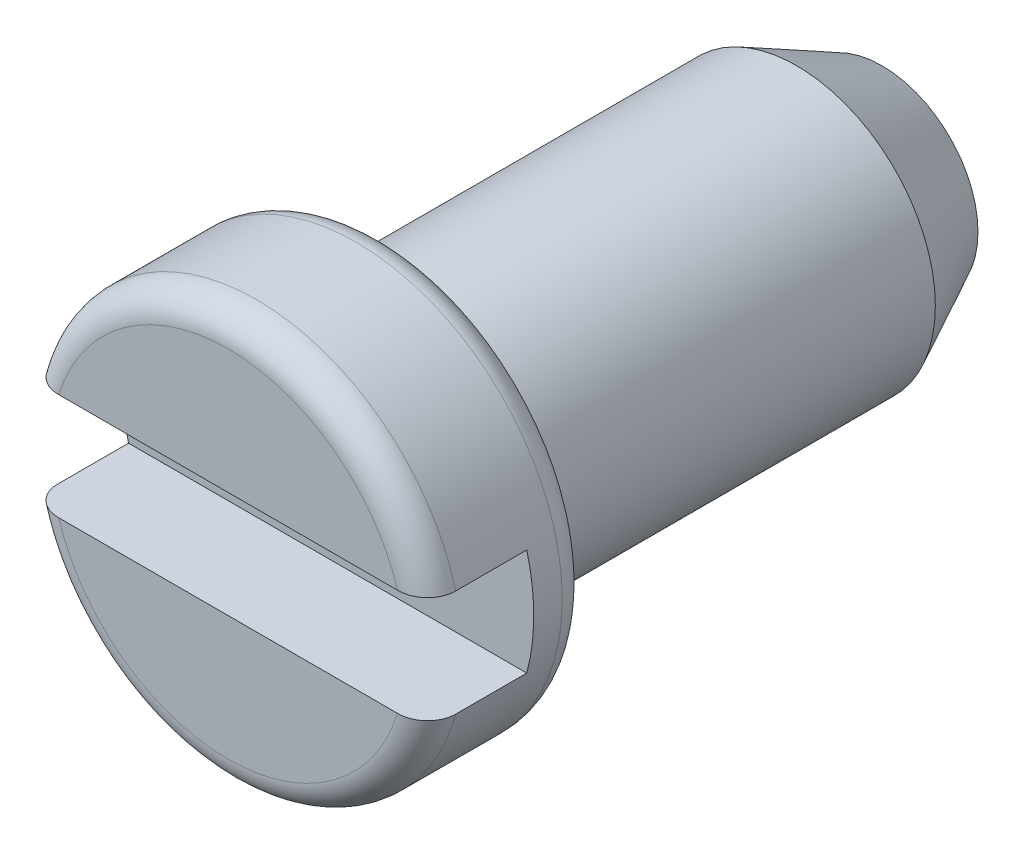
ISO-10303-21;
HEADER;
FILE_DESCRIPTION(('STEP AP214'),'2;1');
FILE_NAME('part.step','',(''),(''),'','','');
FILE_SCHEMA(('AUTOMOTIVE_DESIGN { 1 0 10303 214 1 1 1 1 }'));
ENDSEC;
DATA;
#1=APPLICATION_CONTEXT('core data for automotive mechanical design processes');
#2=APPLICATION_PROTOCOL_DEFINITION('international standard','automotive_design',2000,#1);
#3=PRODUCT_CONTEXT('',#1,'mechanical');
#4=PRODUCT('Part','Part','',(#3));
#5=PRODUCT_RELATED_PRODUCT_CATEGORY('part','',(#4));
#6=PRODUCT_DEFINITION_FORMATION('','',#4);
#7=PRODUCT_DEFINITION_CONTEXT('part definition',#1,'design');
#8=PRODUCT_DEFINITION('design','',#6,#7);
#9=PRODUCT_DEFINITION_SHAPE('','',#8);
#10=(LENGTH_UNIT() NAMED_UNIT(*) SI_UNIT(.MILLI.,.METRE.));
#11=(NAMED_UNIT(*) PLANE_ANGLE_UNIT() SI_UNIT($,.RADIAN.));
#12=(NAMED_UNIT(*) SI_UNIT($,.STERADIAN.) SOLID_ANGLE_UNIT());
#13=UNCERTAINTY_MEASURE_WITH_UNIT(LENGTH_MEASURE(1.E-05),#10,'distance_accuracy_value','');
#14=(GEOMETRIC_REPRESENTATION_CONTEXT(3) GLOBAL_UNCERTAINTY_ASSIGNED_CONTEXT((#13)) GLOBAL_UNIT_ASSIGNED_CONTEXT((#10,
#11,#12)) REPRESENTATION_CONTEXT('',''));
#15=CARTESIAN_POINT('',(0.,0.,0.));
#16=DIRECTION('',(0.,0.,1.));
#17=DIRECTION('',(1.,0.,0.));
#18=AXIS2_PLACEMENT_3D('',#15,#16,#17);
#19=CARTESIAN_POINT('',(0.,0.,0.35));
#20=DIRECTION('',(0.,0.,-1.));
#21=DIRECTION('',(-1.,0.,0.));
#22=AXIS2_PLACEMENT_3D('',#19,#20,#21);
#23=TOROIDAL_SURFACE('',#22,1.25,0.2);
#24=CARTESIAN_POINT('',(-1.192424001771,0.375,0.55));
#25=CARTESIAN_POINT('',(-1.205905275149,0.375,0.55));
#26=CARTESIAN_POINT('',(-1.219179769755,0.375,0.548770877976));
#27=CARTESIAN_POINT('',(-1.238790043109,0.375,0.545135223558));
#28=CARTESIAN_POINT('',(-1.248519300116,0.375,0.542866356948));
#29=CARTESIAN_POINT('',(-1.258131670012,0.375,0.539902696952));
#30=CARTESIAN_POINT('',(-1.264513248889,0.375,0.537768406951));
#31=CARTESIAN_POINT('',(-1.267686206382,0.375,0.536623074632));
#32=CARTESIAN_POINT('',(-1.283315459234,0.375,0.53056053273));
#33=CARTESIAN_POINT('',(-1.295202592734,0.375,0.524602415318));
#34=CARTESIAN_POINT('',(-1.312110903912,0.375,0.514006734822));
#35=CARTESIAN_POINT('',(-1.317592261197,0.375,0.510196599031));
#36=CARTESIAN_POINT('',(-1.325572501873,0.375,0.504046634682));
#37=CARTESIAN_POINT('',(-1.3281982007,0.375,0.501918522815));
#38=CARTESIAN_POINT('',(-1.333312426626,0.375,0.497560014096));
#39=CARTESIAN_POINT('',(-1.345779523391,0.375,0.486388054892));
#40=CARTESIAN_POINT('',(-1.356699606449,0.375,0.47387689637));
#41=CARTESIAN_POINT('',(-1.366358990695,0.375,0.460274391995));
#42=CARTESIAN_POINT('',(-1.368227266987,0.375,0.457498834191));
#43=CARTESIAN_POINT('',(-1.371833646111,0.375,0.451835031665));
#44=CARTESIAN_POINT('',(-1.373576335314,0.375,0.448938193654));
#45=CARTESIAN_POINT('',(-1.378553308638,0.375,0.440164075521));
#46=CARTESIAN_POINT('',(-1.381547323516,0.375,0.434191477719));
#47=CARTESIAN_POINT('',(-1.389580085944,0.375,0.415912728155));
#48=CARTESIAN_POINT('',(-1.393679256042,0.375,0.403249310381));
#49=CARTESIAN_POINT('',(-1.397164479788,0.375,0.386796922208));
#50=CARTESIAN_POINT('',(-1.397778678454,0.375,0.383472722872));
#51=CARTESIAN_POINT('',(-1.398828487205,0.375,0.376822868939));
#52=CARTESIAN_POINT('',(-1.400140335165,0.375,0.366823180448));
#53=CARTESIAN_POINT('',(-1.400669482783,0.375,0.356749327774));
#54=CARTESIAN_POINT('',(-1.400669482783,0.375,0.35));
#55=B_SPLINE_CURVE_WITH_KNOTS('',3,(#24,#25,#26,#27,#28,#29,#30,#31,#32,#33,#34,#35,#36,#37,#38,
#39,#40,#41,#42,#43,#44,#45,#46,#47,#48,#49,#50,#51,#52,#53,#54),.UNSPECIFIED.,.F.,.F.,(4,2,1,2,
2,2,2,2,1,2,2,2,2,2,2,1,4),(0.,0.125,0.1875,0.21875,0.25,0.375,0.4375,0.46875,0.5,0.625,0.65625,
0.6875,0.75,0.875,0.90625,0.9375,1.),.UNSPECIFIED.);
#56=CARTESIAN_POINT('',(-1.192424001771,0.375,0.55));
#57=VERTEX_POINT('',#56);
#58=CARTESIAN_POINT('',(-1.400669482783,0.375,0.35));
#59=VERTEX_POINT('',#58);
#60=EDGE_CURVE('E28',#57,#59,#55,.T.);
#61=ORIENTED_EDGE('',*,*,#60,.F.);
#62=CARTESIAN_POINT('',(0.,0.,0.55));
#63=DIRECTION('',(0.,0.,-1.));
#64=DIRECTION('',(-1.,0.,0.));
#65=AXIS2_PLACEMENT_3D('',#62,#63,#64);
#66=CIRCLE('',#65,1.25);
#67=CARTESIAN_POINT('',(1.192424001771,0.375,0.55));
#68=VERTEX_POINT('',#67);
#69=EDGE_CURVE('E145',#57,#68,#66,.T.);
#70=ORIENTED_EDGE('',*,*,#69,.T.);
#71=CARTESIAN_POINT('',(1.400669482783,0.375,0.35));
#72=CARTESIAN_POINT('',(1.400669482783,0.375,0.36348821144));
#73=CARTESIAN_POINT('',(1.39927155506,0.375,0.376736777679));
#74=CARTESIAN_POINT('',(1.395170145075,0.375,0.396265994666));
#75=CARTESIAN_POINT('',(1.393466300755,0.375,0.40271801224));
#76=CARTESIAN_POINT('',(1.39039370633,0.375,0.412307439359));
#77=CARTESIAN_POINT('',(1.389279792836,0.375,0.415497299082));
#78=CARTESIAN_POINT('',(1.386901256482,0.375,0.421781597308));
#79=CARTESIAN_POINT('',(1.380569435789,0.375,0.437278736234));
#80=CARTESIAN_POINT('',(1.372381183842,0.375,0.451747167472));
#81=CARTESIAN_POINT('',(1.360794058521,0.375,0.468133335205));
#82=CARTESIAN_POINT('',(1.356612252272,0.375,0.473455476089));
#83=CARTESIAN_POINT('',(1.347817064944,0.375,0.483562464125));
#84=CARTESIAN_POINT('',(1.338571221684,0.375,0.493171067916));
#85=CARTESIAN_POINT('',(1.325922106319,0.375,0.503974379226));
#86=CARTESIAN_POINT('',(1.317842676846,0.375,0.509914514783));
#87=CARTESIAN_POINT('',(1.312346220497,0.375,0.513752767173));
#88=CARTESIAN_POINT('',(1.309535838993,0.375,0.515615433562));
#89=CARTESIAN_POINT('',(1.295296681157,0.375,0.524562472345));
#90=CARTESIAN_POINT('',(1.283384656534,0.375,0.530521562207));
#91=CARTESIAN_POINT('',(1.264776905598,0.375,0.537757526588));
#92=CARTESIAN_POINT('',(1.258450133864,0.375,0.539883659122));
#93=CARTESIAN_POINT('',(1.248771052989,0.375,0.542637995169));
#94=CARTESIAN_POINT('',(1.245505938492,0.375,0.543485034585));
#95=CARTESIAN_POINT('',(1.238960518328,0.375,0.545020529773));
#96=CARTESIAN_POINT('',(1.222547899568,0.375,0.548465328392));
#97=CARTESIAN_POINT('',(1.205897358943,0.375,0.55));
#98=CARTESIAN_POINT('',(1.192424001771,0.375,0.55));
#99=B_SPLINE_CURVE_WITH_KNOTS('',3,(#71,#72,#73,#74,#75,#76,#77,#78,#79,#80,#81,#82,#83,#84,#85,
#86,#87,#88,#89,#90,#91,#92,#93,#94,#95,#96,#97,#98),.UNSPECIFIED.,.F.,.F.,(4,2,2,2,1,2,2,1,1,2,
2,2,2,2,1,4),(0.,0.125,0.1875,0.21875,0.25,0.375,0.4375,0.5,0.5625,0.59375,0.625,0.75,0.8125,
0.84375,0.875,1.),.UNSPECIFIED.);
#100=CARTESIAN_POINT('',(1.400669482783,0.375,0.35));
#101=VERTEX_POINT('',#100);
#102=EDGE_CURVE('E41',#101,#68,#99,.T.);
#103=ORIENTED_EDGE('',*,*,#102,.F.);
#104=CARTESIAN_POINT('',(0.,0.,0.35));
#105=DIRECTION('',(0.,0.,-1.));
#106=DIRECTION('',(-1.,0.,0.));
#107=AXIS2_PLACEMENT_3D('',#104,#105,#106);
#108=CIRCLE('',#107,1.45);
#109=EDGE_CURVE('E127',#59,#101,#108,.T.);
#110=ORIENTED_EDGE('',*,*,#109,.F.);
#111=EDGE_LOOP('',(#61,#70,#103,#110));
#112=FACE_BOUND('',#111,.T.);
#113=ADVANCED_FACE('F17',(#112),#23,.T.);
#114=CARTESIAN_POINT('',(0.,0.,-0.35));
#115=DIRECTION('',(0.,0.,-1.));
#116=DIRECTION('',(-1.,0.,0.));
#117=AXIS2_PLACEMENT_3D('',#114,#115,#116);
#118=TOROIDAL_SURFACE('',#117,1.25,0.2);
#119=CARTESIAN_POINT('',(0.,0.,-0.55));
#120=DIRECTION('',(0.,0.,-1.));
#121=DIRECTION('',(-1.,0.,0.));
#122=AXIS2_PLACEMENT_3D('',#119,#120,#121);
#123=CIRCLE('',#122,1.25);
#124=CARTESIAN_POINT('',(-1.25,0.,-0.55));
#125=VERTEX_POINT('',#124);
#126=EDGE_CURVE('E146',#125,#125,#123,.T.);
#127=ORIENTED_EDGE('',*,*,#126,.F.);
#128=EDGE_LOOP('',(#127));
#129=FACE_BOUND('',#128,.T.);
#130=CARTESIAN_POINT('',(0.,0.,-0.35));
#131=DIRECTION('',(0.,0.,-1.));
#132=DIRECTION('',(-1.,0.,0.));
#133=AXIS2_PLACEMENT_3D('',#130,#131,#132);
#134=CIRCLE('',#133,1.45);
#135=CARTESIAN_POINT('',(-1.45,0.,-0.35));
#136=VERTEX_POINT('',#135);
#137=EDGE_CURVE('E264',#136,#136,#134,.T.);
#138=ORIENTED_EDGE('',*,*,#137,.T.);
#139=EDGE_LOOP('',(#138));
#140=FACE_BOUND('',#139,.T.);
#141=ADVANCED_FACE('F199',(#129,#140),#118,.T.);
#142=CARTESIAN_POINT('',(0.,0.,0.35));
#143=DIRECTION('',(0.,0.,-1.));
#144=DIRECTION('',(-1.,0.,0.));
#145=AXIS2_PLACEMENT_3D('',#142,#143,#144);
#146=TOROIDAL_SURFACE('',#145,1.25,0.2);
#147=CARTESIAN_POINT('',(1.192424001771,-0.375,0.55));
#148=CARTESIAN_POINT('',(1.205905275149,-0.375,0.55));
#149=CARTESIAN_POINT('',(1.219179769755,-0.375,0.548770877976));
#150=CARTESIAN_POINT('',(1.238790043109,-0.375,0.545135223558));
#151=CARTESIAN_POINT('',(1.248519300116,-0.375,0.542866356948));
#152=CARTESIAN_POINT('',(1.258131670012,-0.375,0.539902696952));
#153=CARTESIAN_POINT('',(1.264513248889,-0.375,0.537768406951));
#154=CARTESIAN_POINT('',(1.267686206382,-0.375,0.536623074632));
#155=CARTESIAN_POINT('',(1.283315459234,-0.375,0.53056053273));
#156=CARTESIAN_POINT('',(1.295202592734,-0.375,0.524602415318));
#157=CARTESIAN_POINT('',(1.312110903912,-0.375,0.514006734822));
#158=CARTESIAN_POINT('',(1.317592261197,-0.375,0.510196599031));
#159=CARTESIAN_POINT('',(1.325572501873,-0.375,0.504046634682));
#160=CARTESIAN_POINT('',(1.3281982007,-0.375,0.501918522815));
#161=CARTESIAN_POINT('',(1.333312426626,-0.375,0.497560014096));
#162=CARTESIAN_POINT('',(1.345779523391,-0.375,0.486388054892));
#163=CARTESIAN_POINT('',(1.356699606449,-0.375,0.47387689637));
#164=CARTESIAN_POINT('',(1.366358990695,-0.375,0.460274391995));
#165=CARTESIAN_POINT('',(1.368227266987,-0.375,0.457498834191));
#166=CARTESIAN_POINT('',(1.371833646111,-0.375,0.451835031665));
#167=CARTESIAN_POINT('',(1.373576335314,-0.375,0.448938193654));
#168=CARTESIAN_POINT('',(1.378553308638,-0.375,0.440164075521));
#169=CARTESIAN_POINT('',(1.381547323516,-0.375,0.434191477719));
#170=CARTESIAN_POINT('',(1.389580085944,-0.375,0.415912728155));
#171=CARTESIAN_POINT('',(1.393679256042,-0.375,0.403249310381));
#172=CARTESIAN_POINT('',(1.397164479788,-0.375,0.386796922208));
#173=CARTESIAN_POINT('',(1.397778678454,-0.375,0.383472722872));
#174=CARTESIAN_POINT('',(1.398828487205,-0.375,0.376822868939));
#175=CARTESIAN_POINT('',(1.400140335165,-0.375,0.366823180448));
#176=CARTESIAN_POINT('',(1.400669482783,-0.375,0.356749327774));
#177=CARTESIAN_POINT('',(1.400669482783,-0.375,0.35));
#178=B_SPLINE_CURVE_WITH_KNOTS('',3,(#147,#148,#149,#150,#151,#152,#153,#154,#155,#156,#157,
#158,#159,#160,#161,#162,#163,#164,#165,#166,#167,#168,#169,#170,#171,#172,#173,#174,#175,#176,
#177),.UNSPECIFIED.,.F.,.F.,(4,2,1,2,2,2,2,2,1,2,2,2,2,2,2,1,4),(0.,0.125,0.1875,0.21875,0.25,
0.375,0.4375,0.46875,0.5,0.625,0.65625,0.6875,0.75,0.875,0.90625,0.9375,1.),.UNSPECIFIED.);
#179=CARTESIAN_POINT('',(1.192424001771,-0.375,0.55));
#180=VERTEX_POINT('',#179);
#181=CARTESIAN_POINT('',(1.400669482783,-0.375,0.35));
#182=VERTEX_POINT('',#181);
#183=EDGE_CURVE('E96',#180,#182,#178,.T.);
#184=ORIENTED_EDGE('',*,*,#183,.F.);
#185=CARTESIAN_POINT('',(0.,0.,0.55));
#186=DIRECTION('',(0.,0.,-1.));
#187=DIRECTION('',(-1.,0.,0.));
#188=AXIS2_PLACEMENT_3D('',#185,#186,#187);
#189=CIRCLE('',#188,1.25);
#190=CARTESIAN_POINT('',(-1.192424001771,-0.375,0.55));
#191=VERTEX_POINT('',#190);
#192=EDGE_CURVE('E138',#180,#191,#189,.T.);
#193=ORIENTED_EDGE('',*,*,#192,.T.);
#194=CARTESIAN_POINT('',(-1.400669482783,-0.375,0.35));
#195=CARTESIAN_POINT('',(-1.400669482783,-0.375,0.36348821144));
#196=CARTESIAN_POINT('',(-1.39927155506,-0.375,0.376736777679));
#197=CARTESIAN_POINT('',(-1.395170145075,-0.375,0.396265994666));
#198=CARTESIAN_POINT('',(-1.393466300755,-0.375,0.40271801224));
#199=CARTESIAN_POINT('',(-1.39039370633,-0.375,0.412307439359));
#200=CARTESIAN_POINT('',(-1.389279792836,-0.375,0.415497299082));
#201=CARTESIAN_POINT('',(-1.386901256482,-0.375,0.421781597308));
#202=CARTESIAN_POINT('',(-1.380569435789,-0.375,0.437278736234));
#203=CARTESIAN_POINT('',(-1.372381183842,-0.375,0.451747167472));
#204=CARTESIAN_POINT('',(-1.360794058521,-0.375,0.468133335205));
#205=CARTESIAN_POINT('',(-1.356612252272,-0.375,0.473455476089));
#206=CARTESIAN_POINT('',(-1.347817064944,-0.375,0.483562464125));
#207=CARTESIAN_POINT('',(-1.338571221684,-0.375,0.493171067916));
#208=CARTESIAN_POINT('',(-1.325922106319,-0.375,0.503974379226));
#209=CARTESIAN_POINT('',(-1.317842676846,-0.375,0.509914514783));
#210=CARTESIAN_POINT('',(-1.312346220497,-0.375,0.513752767173));
#211=CARTESIAN_POINT('',(-1.309535838993,-0.375,0.515615433562));
#212=CARTESIAN_POINT('',(-1.295296681157,-0.375,0.524562472345));
#213=CARTESIAN_POINT('',(-1.283384656534,-0.375,0.530521562207));
#214=CARTESIAN_POINT('',(-1.264776905598,-0.375,0.537757526588));
#215=CARTESIAN_POINT('',(-1.258450133864,-0.375,0.539883659122));
#216=CARTESIAN_POINT('',(-1.248771052989,-0.375,0.542637995169));
#217=CARTESIAN_POINT('',(-1.245505938492,-0.375,0.543485034585));
#218=CARTESIAN_POINT('',(-1.238960518328,-0.375,0.545020529773));
#219=CARTESIAN_POINT('',(-1.222547899568,-0.375,0.548465328392));
#220=CARTESIAN_POINT('',(-1.205897358943,-0.375,0.55));
#221=CARTESIAN_POINT('',(-1.192424001771,-0.375,0.55));
#222=B_SPLINE_CURVE_WITH_KNOTS('',3,(#194,#195,#196,#197,#198,#199,#200,#201,#202,#203,#204,
#205,#206,#207,#208,#209,#210,#211,#212,#213,#214,#215,#216,#217,#218,#219,#220,#221),
.UNSPECIFIED.,.F.,.F.,(4,2,2,2,1,2,2,1,1,2,2,2,2,2,1,4),(0.,0.125,0.1875,0.21875,0.25,0.375,
0.4375,0.5,0.5625,0.59375,0.625,0.75,0.8125,0.84375,0.875,1.),.UNSPECIFIED.);
#223=CARTESIAN_POINT('',(-1.400669482783,-0.375,0.35));
#224=VERTEX_POINT('',#223);
#225=EDGE_CURVE('E20',#224,#191,#222,.T.);
#226=ORIENTED_EDGE('',*,*,#225,.F.);
#227=CARTESIAN_POINT('',(0.,0.,0.35));
#228=DIRECTION('',(0.,0.,-1.));
#229=DIRECTION('',(-1.,0.,0.));
#230=AXIS2_PLACEMENT_3D('',#227,#228,#229);
#231=CIRCLE('',#230,1.45);
#232=EDGE_CURVE('E118',#182,#224,#231,.T.);
#233=ORIENTED_EDGE('',*,*,#232,.F.);
#234=EDGE_LOOP('',(#184,#193,#226,#233));
#235=FACE_BOUND('',#234,.T.);
#236=ADVANCED_FACE('F181',(#235),#146,.T.);
#237=CARTESIAN_POINT('',(0.,0.,-0.15));
#238=DIRECTION('',(0.,0.,-1.));
#239=DIRECTION('',(0.,-1.,0.));
#240=AXIS2_PLACEMENT_3D('',#237,#238,#239);
#241=PLANE('',#240);
#242=CARTESIAN_POINT('',(0.,0.,-0.15));
#243=DIRECTION('',(0.,0.,-1.));
#244=DIRECTION('',(-1.,0.,0.));
#245=AXIS2_PLACEMENT_3D('',#242,#243,#244);
#246=CIRCLE('',#245,1.45);
#247=CARTESIAN_POINT('',(1.400669482783,0.375,-0.15));
#248=VERTEX_POINT('',#247);
#249=CARTESIAN_POINT('',(1.400669482783,-0.375,-0.15));
#250=VERTEX_POINT('',#249);
#251=EDGE_CURVE('E104',#248,#250,#246,.T.);
#252=ORIENTED_EDGE('',*,*,#251,.F.);
#253=DIRECTION('',(1.,0.,0.));
#254=VECTOR('',#253,1.);
#255=CARTESIAN_POINT('',(-2.,0.375,-0.15));
#256=LINE('',#255,#254);
#257=CARTESIAN_POINT('',(-1.400669482783,0.375,-0.15));
#258=VERTEX_POINT('',#257);
#259=EDGE_CURVE('E11',#258,#248,#256,.T.);
#260=ORIENTED_EDGE('',*,*,#259,.F.);
#261=CARTESIAN_POINT('',(0.,0.,-0.15));
#262=DIRECTION('',(0.,0.,-1.));
#263=DIRECTION('',(-1.,0.,0.));
#264=AXIS2_PLACEMENT_3D('',#261,#262,#263);
#265=CIRCLE('',#264,1.45);
#266=CARTESIAN_POINT('',(-1.400669482783,-0.375,-0.15));
#267=VERTEX_POINT('',#266);
#268=EDGE_CURVE('E85',#267,#258,#265,.T.);
#269=ORIENTED_EDGE('',*,*,#268,.F.);
#270=DIRECTION('',(-1.,0.,0.));
#271=VECTOR('',#270,1.);
#272=CARTESIAN_POINT('',(2.,-0.375,-0.15));
#273=LINE('',#272,#271);
#274=EDGE_CURVE('E100',#250,#267,#273,.T.);
#275=ORIENTED_EDGE('',*,*,#274,.F.);
#276=EDGE_LOOP('',(#252,#260,#269,#275));
#277=FACE_BOUND('',#276,.T.);
#278=ADVANCED_FACE('F102',(#277),#241,.F.);
#279=CARTESIAN_POINT('',(-2.,0.375,-0.15));
#280=DIRECTION('',(0.,-1.,0.));
#281=DIRECTION('',(0.,0.,-1.));
#282=AXIS2_PLACEMENT_3D('',#279,#280,#281);
#283=PLANE('',#282);
#284=DIRECTION('',(0.,0.,-1.));
#285=VECTOR('',#284,1.);
#286=CARTESIAN_POINT('',(1.400669482783,0.375,0.55));
#287=LINE('',#286,#285);
#288=EDGE_CURVE('E122',#101,#248,#287,.T.);
#289=ORIENTED_EDGE('',*,*,#288,.F.);
#290=ORIENTED_EDGE('',*,*,#102,.T.);
#291=DIRECTION('',(1.,0.,0.));
#292=VECTOR('',#291,1.);
#293=CARTESIAN_POINT('',(-2.,0.375,0.55));
#294=LINE('',#293,#292);
#295=EDGE_CURVE('E141',#57,#68,#294,.T.);
#296=ORIENTED_EDGE('',*,*,#295,.F.);
#297=ORIENTED_EDGE('',*,*,#60,.T.);
#298=DIRECTION('',(0.,0.,-1.));
#299=VECTOR('',#298,1.);
#300=CARTESIAN_POINT('',(-1.400669482783,0.375,0.55));
#301=LINE('',#300,#299);
#302=EDGE_CURVE('E237',#59,#258,#301,.T.);
#303=ORIENTED_EDGE('',*,*,#302,.T.);
#304=ORIENTED_EDGE('',*,*,#259,.T.);
#305=EDGE_LOOP('',(#289,#290,#296,#297,#303,#304));
#306=FACE_BOUND('',#305,.T.);
#307=ADVANCED_FACE('F224',(#306),#283,.T.);
#308=CARTESIAN_POINT('',(2.,-0.375,-0.15));
#309=DIRECTION('',(0.,1.,0.));
#310=DIRECTION('',(1.,0.,0.));
#311=AXIS2_PLACEMENT_3D('',#308,#309,#310);
#312=PLANE('',#311);
#313=DIRECTION('',(0.,0.,-1.));
#314=VECTOR('',#313,1.);
#315=CARTESIAN_POINT('',(-1.400669482783,-0.375,0.55));
#316=LINE('',#315,#314);
#317=EDGE_CURVE('E131',#224,#267,#316,.T.);
#318=ORIENTED_EDGE('',*,*,#317,.F.);
#319=ORIENTED_EDGE('',*,*,#225,.T.);
#320=DIRECTION('',(-1.,0.,0.));
#321=VECTOR('',#320,1.);
#322=CARTESIAN_POINT('',(2.,-0.375,0.55));
#323=LINE('',#322,#321);
#324=EDGE_CURVE('E134',#180,#191,#323,.T.);
#325=ORIENTED_EDGE('',*,*,#324,.F.);
#326=ORIENTED_EDGE('',*,*,#183,.T.);
#327=DIRECTION('',(0.,0.,-1.));
#328=VECTOR('',#327,1.);
#329=CARTESIAN_POINT('',(1.400669482783,-0.375,0.55));
#330=LINE('',#329,#328);
#331=EDGE_CURVE('E112',#182,#250,#330,.T.);
#332=ORIENTED_EDGE('',*,*,#331,.T.);
#333=ORIENTED_EDGE('',*,*,#274,.T.);
#334=EDGE_LOOP('',(#318,#319,#325,#326,#332,#333));
#335=FACE_BOUND('',#334,.T.);
#336=ADVANCED_FACE('F113',(#335),#312,.T.);
#337=CARTESIAN_POINT('',(0.,0.,-3.45));
#338=DIRECTION('',(0.,0.,1.));
#339=DIRECTION('',(1.,0.,0.));
#340=AXIS2_PLACEMENT_3D('',#337,#338,#339);
#341=CONICAL_SURFACE('',#340,0.975,0.463647609001);
#342=CARTESIAN_POINT('',(0.,0.,-3.45));
#343=DIRECTION('',(0.,0.,1.));
#344=DIRECTION('',(1.,0.,0.));
#345=AXIS2_PLACEMENT_3D('',#342,#343,#344);
#346=CIRCLE('',#345,0.975);
#347=CARTESIAN_POINT('',(0.975,0.,-3.45));
#348=VERTEX_POINT('',#347);
#349=EDGE_CURVE('E151',#348,#348,#346,.T.);
#350=ORIENTED_EDGE('',*,*,#349,.F.);
#351=EDGE_LOOP('',(#350));
#352=FACE_BOUND('',#351,.T.);
#353=CARTESIAN_POINT('',(0.,0.,-4.05));
#354=DIRECTION('',(0.,0.,1.));
#355=DIRECTION('',(1.,0.,0.));
#356=AXIS2_PLACEMENT_3D('',#353,#354,#355);
#357=CIRCLE('',#356,0.675);
#358=CARTESIAN_POINT('',(0.675,0.,-4.05));
#359=VERTEX_POINT('',#358);
#360=EDGE_CURVE('E155',#359,#359,#357,.T.);
#361=ORIENTED_EDGE('',*,*,#360,.T.);
#362=EDGE_LOOP('',(#361));
#363=FACE_BOUND('',#362,.T.);
#364=ADVANCED_FACE('F210',(#352,#363),#341,.T.);
#365=CARTESIAN_POINT('',(0.,0.,-4.05));
#366=DIRECTION('',(0.,0.,1.));
#367=DIRECTION('',(1.,0.,0.));
#368=AXIS2_PLACEMENT_3D('',#365,#366,#367);
#369=PLANE('',#368);
#370=ORIENTED_EDGE('',*,*,#360,.F.);
#371=EDGE_LOOP('',(#370));
#372=FACE_BOUND('',#371,.T.);
#373=ADVANCED_FACE('F213',(#372),#369,.F.);
#374=CARTESIAN_POINT('',(0.,0.,-4.05));
#375=DIRECTION('',(0.,0.,1.));
#376=DIRECTION('',(1.,0.,0.));
#377=AXIS2_PLACEMENT_3D('',#374,#375,#376);
#378=CYLINDRICAL_SURFACE('',#377,0.975);
#379=CARTESIAN_POINT('',(0.,0.,-0.55));
#380=DIRECTION('',(0.,0.,-1.));
#381=DIRECTION('',(-1.,0.,0.));
#382=AXIS2_PLACEMENT_3D('',#379,#380,#381);
#383=CIRCLE('',#382,0.975);
#384=CARTESIAN_POINT('',(-0.975,0.,-0.55));
#385=VERTEX_POINT('',#384);
#386=EDGE_CURVE('E150',#385,#385,#383,.T.);
#387=ORIENTED_EDGE('',*,*,#386,.T.);
#388=EDGE_LOOP('',(#387));
#389=FACE_BOUND('',#388,.T.);
#390=ORIENTED_EDGE('',*,*,#349,.T.);
#391=EDGE_LOOP('',(#390));
#392=FACE_BOUND('',#391,.T.);
#393=ADVANCED_FACE('F217',(#389,#392),#378,.T.);
#394=CARTESIAN_POINT('',(0.,0.,-0.55));
#395=DIRECTION('',(0.,0.,-1.));
#396=DIRECTION('',(0.,-1.,0.));
#397=AXIS2_PLACEMENT_3D('',#394,#395,#396);
#398=PLANE('',#397);
#399=ORIENTED_EDGE('',*,*,#386,.F.);
#400=EDGE_LOOP('',(#399));
#401=FACE_BOUND('',#400,.T.);
#402=ORIENTED_EDGE('',*,*,#126,.T.);
#403=EDGE_LOOP('',(#402));
#404=FACE_BOUND('',#403,.T.);
#405=ADVANCED_FACE('F194',(#401,#404),#398,.T.);
#406=CARTESIAN_POINT('',(0.,0.,0.55));
#407=DIRECTION('',(0.,0.,-1.));
#408=DIRECTION('',(0.,-1.,0.));
#409=AXIS2_PLACEMENT_3D('',#406,#407,#408);
#410=PLANE('',#409);
#411=ORIENTED_EDGE('',*,*,#295,.T.);
#412=ORIENTED_EDGE('',*,*,#69,.F.);
#413=EDGE_LOOP('',(#411,#412));
#414=FACE_BOUND('',#413,.T.);
#415=ADVANCED_FACE('F185',(#414),#410,.F.);
#416=CARTESIAN_POINT('',(0.,0.,0.55));
#417=DIRECTION('',(0.,0.,-1.));
#418=DIRECTION('',(0.,-1.,0.));
#419=AXIS2_PLACEMENT_3D('',#416,#417,#418);
#420=PLANE('',#419);
#421=ORIENTED_EDGE('',*,*,#324,.T.);
#422=ORIENTED_EDGE('',*,*,#192,.F.);
#423=EDGE_LOOP('',(#421,#422));
#424=FACE_BOUND('',#423,.T.);
#425=ADVANCED_FACE('F183',(#424),#420,.F.);
#426=CARTESIAN_POINT('',(0.,0.,0.55));
#427=DIRECTION('',(0.,0.,-1.));
#428=DIRECTION('',(-1.,0.,0.));
#429=AXIS2_PLACEMENT_3D('',#426,#427,#428);
#430=CYLINDRICAL_SURFACE('',#429,1.45);
#431=ORIENTED_EDGE('',*,*,#137,.F.);
#432=EDGE_LOOP('',(#431));
#433=FACE_BOUND('',#432,.T.);
#434=ORIENTED_EDGE('',*,*,#317,.T.);
#435=ORIENTED_EDGE('',*,*,#268,.T.);
#436=ORIENTED_EDGE('',*,*,#302,.F.);
#437=ORIENTED_EDGE('',*,*,#109,.T.);
#438=ORIENTED_EDGE('',*,*,#288,.T.);
#439=ORIENTED_EDGE('',*,*,#251,.T.);
#440=ORIENTED_EDGE('',*,*,#331,.F.);
#441=ORIENTED_EDGE('',*,*,#232,.T.);
#442=EDGE_LOOP('',(#434,#435,#436,#437,#438,#439,#440,#441));
#443=FACE_BOUND('',#442,.T.);
#444=ADVANCED_FACE('F120',(#433,#443),#430,.T.);
#445=CLOSED_SHELL('',(#113,#141,#236,#278,#307,#336,#364,#373,#393,#405,#415,#425,#444));
#446=MANIFOLD_SOLID_BREP('B1',#445);
#447=ADVANCED_BREP_SHAPE_REPRESENTATION('',(#18,#446),#14);
#448=SHAPE_DEFINITION_REPRESENTATION(#9,#447);
ENDSEC;
END-ISO-10303-21;
